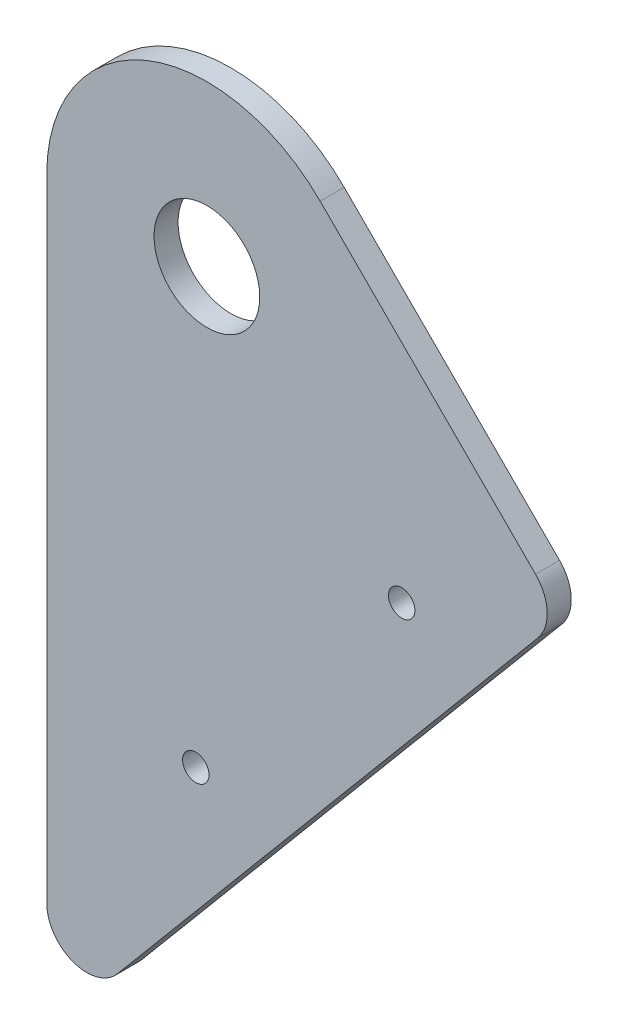
ISO-10303-21;
HEADER;
FILE_DESCRIPTION(('STEP AP214'),'2;1');
FILE_NAME('part.step','',(''),(''),'','','');
FILE_SCHEMA(('AUTOMOTIVE_DESIGN { 1 0 10303 214 1 1 1 1 }'));
ENDSEC;
DATA;
#1=APPLICATION_CONTEXT('core data for automotive mechanical design processes');
#2=APPLICATION_PROTOCOL_DEFINITION('international standard','automotive_design',2000,#1);
#3=PRODUCT_CONTEXT('',#1,'mechanical');
#4=PRODUCT('Part','Part','',(#3));
#5=PRODUCT_RELATED_PRODUCT_CATEGORY('part','',(#4));
#6=PRODUCT_DEFINITION_FORMATION('','',#4);
#7=PRODUCT_DEFINITION_CONTEXT('part definition',#1,'design');
#8=PRODUCT_DEFINITION('design','',#6,#7);
#9=PRODUCT_DEFINITION_SHAPE('','',#8);
#10=(LENGTH_UNIT() NAMED_UNIT(*) SI_UNIT(.MILLI.,.METRE.));
#11=(NAMED_UNIT(*) PLANE_ANGLE_UNIT() SI_UNIT($,.RADIAN.));
#12=(NAMED_UNIT(*) SI_UNIT($,.STERADIAN.) SOLID_ANGLE_UNIT());
#13=UNCERTAINTY_MEASURE_WITH_UNIT(LENGTH_MEASURE(1.E-05),#10,'distance_accuracy_value','');
#14=(GEOMETRIC_REPRESENTATION_CONTEXT(3) GLOBAL_UNCERTAINTY_ASSIGNED_CONTEXT((#13)) GLOBAL_UNIT_ASSIGNED_CONTEXT((#10,
#11,#12)) REPRESENTATION_CONTEXT('',''));
#15=CARTESIAN_POINT('',(0.,0.,0.));
#16=DIRECTION('',(0.,0.,1.));
#17=DIRECTION('',(1.,0.,0.));
#18=AXIS2_PLACEMENT_3D('',#15,#16,#17);
#19=CARTESIAN_POINT('',(0.,0.,3.));
#20=DIRECTION('',(1.,0.,0.));
#21=DIRECTION('',(0.,0.,-1.));
#22=AXIS2_PLACEMENT_3D('',#19,#20,#21);
#23=PLANE('',#22);
#24=DIRECTION('',(0.,-1.,0.));
#25=VECTOR('',#24,1.);
#26=CARTESIAN_POINT('',(0.,0.,0.));
#27=LINE('',#26,#25);
#28=CARTESIAN_POINT('',(0.,92.5989340330901,0.));
#29=VERTEX_POINT('',#28);
#30=CARTESIAN_POINT('',(0.,13.7373870972732,0.));
#31=VERTEX_POINT('',#30);
#32=EDGE_CURVE('E128',#29,#31,#27,.T.);
#33=ORIENTED_EDGE('',*,*,#32,.T.);
#34=DIRECTION('',(0.,0.,-1.));
#35=VECTOR('',#34,1.);
#36=CARTESIAN_POINT('',(0.,13.7373870972732,3.));
#37=LINE('',#36,#35);
#38=CARTESIAN_POINT('',(0.,13.7373870972732,3.));
#39=VERTEX_POINT('',#38);
#40=EDGE_CURVE('E11',#31,#39,#37,.F.);
#41=ORIENTED_EDGE('',*,*,#40,.T.);
#42=DIRECTION('',(0.,-1.,0.));
#43=VECTOR('',#42,1.);
#44=CARTESIAN_POINT('',(0.,0.,3.));
#45=LINE('',#44,#43);
#46=CARTESIAN_POINT('',(0.,92.5989340330901,3.));
#47=VERTEX_POINT('',#46);
#48=EDGE_CURVE('E147',#47,#39,#45,.T.);
#49=ORIENTED_EDGE('',*,*,#48,.F.);
#50=DIRECTION('',(0.,0.,-1.));
#51=VECTOR('',#50,1.);
#52=CARTESIAN_POINT('',(0.,92.5989340330901,3.));
#53=LINE('',#52,#51);
#54=EDGE_CURVE('E111',#47,#29,#53,.T.);
#55=ORIENTED_EDGE('',*,*,#54,.T.);
#56=EDGE_LOOP('',(#33,#41,#49,#55));
#57=FACE_BOUND('',#56,.T.);
#58=ADVANCED_FACE('F37',(#57),#23,.F.);
#59=CARTESIAN_POINT('',(0.,0.,3.));
#60=DIRECTION('',(-0.766044443118982,0.642787609686535,0.));
#61=DIRECTION('',(-0.642787609686535,-0.766044443118982,0.));
#62=AXIS2_PLACEMENT_3D('',#59,#60,#61);
#63=PLANE('',#62);
#64=DIRECTION('',(0.642787609686535,0.766044443118982,0.));
#65=VECTOR('',#64,1.);
#66=CARTESIAN_POINT('',(0.,0.,0.));
#67=LINE('',#66,#65);
#68=CARTESIAN_POINT('',(8.83022221559491,10.5234490488406,0.));
#69=VERTEX_POINT('',#68);
#70=CARTESIAN_POINT('',(61.3337293435139,73.0946922923345,0.));
#71=VERTEX_POINT('',#70);
#72=EDGE_CURVE('E130',#69,#71,#67,.T.);
#73=ORIENTED_EDGE('',*,*,#72,.T.);
#74=DIRECTION('',(0.,0.,-1.));
#75=VECTOR('',#74,1.);
#76=CARTESIAN_POINT('',(61.3337293435139,73.0946922923346,3.));
#77=LINE('',#76,#75);
#78=CARTESIAN_POINT('',(61.3337293435139,73.0946922923345,3.));
#79=VERTEX_POINT('',#78);
#80=EDGE_CURVE('E58',#71,#79,#77,.F.);
#81=ORIENTED_EDGE('',*,*,#80,.T.);
#82=DIRECTION('',(0.642787609686535,0.766044443118982,0.));
#83=VECTOR('',#82,1.);
#84=CARTESIAN_POINT('',(0.,0.,3.));
#85=LINE('',#84,#83);
#86=CARTESIAN_POINT('',(8.83022221559491,10.5234490488406,3.));
#87=VERTEX_POINT('',#86);
#88=EDGE_CURVE('E101',#87,#79,#85,.T.);
#89=ORIENTED_EDGE('',*,*,#88,.F.);
#90=DIRECTION('',(0.,0.,-1.));
#91=VECTOR('',#90,1.);
#92=CARTESIAN_POINT('',(8.83022221559491,10.5234490488406,3.));
#93=LINE('',#92,#91);
#94=EDGE_CURVE('E141',#87,#69,#93,.T.);
#95=ORIENTED_EDGE('',*,*,#94,.T.);
#96=EDGE_LOOP('',(#73,#81,#89,#95));
#97=FACE_BOUND('',#96,.T.);
#98=ADVANCED_FACE('F150',(#97),#63,.F.);
#99=CARTESIAN_POINT('',(70.4416026402761,70.4416026402755,3.));
#100=DIRECTION('',(-0.707106781186551,-0.707106781186544,0.));
#101=DIRECTION('',(0.707106781186544,-0.707106781186551,0.));
#102=AXIS2_PLACEMENT_3D('',#99,#100,#101);
#103=PLANE('',#102);
#104=DIRECTION('',(-0.707106781186544,0.707106781186551,0.));
#105=VECTOR('',#104,1.);
#106=CARTESIAN_POINT('',(70.4416026402761,70.4416026402755,3.));
#107=LINE('',#106,#105);
#108=CARTESIAN_POINT('',(61.0390410338518,79.8441642466999,3.));
#109=VERTEX_POINT('',#108);
#110=CARTESIAN_POINT('',(34.142135623731,106.741069656821,3.));
#111=VERTEX_POINT('',#110);
#112=EDGE_CURVE('E91',#109,#111,#107,.T.);
#113=ORIENTED_EDGE('',*,*,#112,.F.);
#114=DIRECTION('',(0.,0.,-1.));
#115=VECTOR('',#114,1.);
#116=CARTESIAN_POINT('',(61.0390410338518,79.8441642466999,3.));
#117=LINE('',#116,#115);
#118=CARTESIAN_POINT('',(61.0390410338518,79.8441642466999,0.));
#119=VERTEX_POINT('',#118);
#120=EDGE_CURVE('E110',#109,#119,#117,.T.);
#121=ORIENTED_EDGE('',*,*,#120,.T.);
#122=DIRECTION('',(-0.707106781186544,0.707106781186551,0.));
#123=VECTOR('',#122,1.);
#124=CARTESIAN_POINT('',(70.4416026402761,70.4416026402755,0.));
#125=LINE('',#124,#123);
#126=CARTESIAN_POINT('',(34.142135623731,106.741069656821,0.));
#127=VERTEX_POINT('',#126);
#128=EDGE_CURVE('E107',#119,#127,#125,.T.);
#129=ORIENTED_EDGE('',*,*,#128,.T.);
#130=DIRECTION('',(0.,0.,-1.));
#131=VECTOR('',#130,1.);
#132=CARTESIAN_POINT('',(34.142135623731,106.741069656821,3.));
#133=LINE('',#132,#131);
#134=EDGE_CURVE('E104',#111,#127,#133,.T.);
#135=ORIENTED_EDGE('',*,*,#134,.F.);
#136=EDGE_LOOP('',(#113,#121,#129,#135));
#137=FACE_BOUND('',#136,.T.);
#138=ADVANCED_FACE('F105',(#137),#103,.F.);
#139=CARTESIAN_POINT('',(20.,92.5989340330901,3.));
#140=DIRECTION('',(0.,0.,-1.));
#141=DIRECTION('',(-1.,0.,0.));
#142=AXIS2_PLACEMENT_3D('',#139,#140,#141);
#143=CYLINDRICAL_SURFACE('',#142,6.6);
#144=CARTESIAN_POINT('',(20.,92.5989340330901,3.));
#145=DIRECTION('',(0.,0.,1.));
#146=DIRECTION('',(1.,0.,0.));
#147=AXIS2_PLACEMENT_3D('',#144,#145,#146);
#148=CIRCLE('',#147,6.6);
#149=CARTESIAN_POINT('',(26.6,92.5989340330901,3.));
#150=VERTEX_POINT('',#149);
#151=EDGE_CURVE('E155',#150,#150,#148,.T.);
#152=ORIENTED_EDGE('',*,*,#151,.T.);
#153=EDGE_LOOP('',(#152));
#154=FACE_BOUND('',#153,.T.);
#155=CARTESIAN_POINT('',(20.,92.5989340330901,0.));
#156=DIRECTION('',(0.,0.,1.));
#157=DIRECTION('',(1.,0.,0.));
#158=AXIS2_PLACEMENT_3D('',#155,#156,#157);
#159=CIRCLE('',#158,6.6);
#160=CARTESIAN_POINT('',(26.6,92.5989340330901,0.));
#161=VERTEX_POINT('',#160);
#162=EDGE_CURVE('E125',#161,#161,#159,.T.);
#163=ORIENTED_EDGE('',*,*,#162,.F.);
#164=EDGE_LOOP('',(#163));
#165=FACE_BOUND('',#164,.T.);
#166=ADVANCED_FACE('F176',(#154,#165),#143,.F.);
#167=CARTESIAN_POINT('',(44.324930632758,68.3816335916834,3.));
#168=DIRECTION('',(0.,0.,-1.));
#169=DIRECTION('',(-1.,0.,0.));
#170=AXIS2_PLACEMENT_3D('',#167,#168,#169);
#171=CYLINDRICAL_SURFACE('',#170,1.65);
#172=CARTESIAN_POINT('',(44.324930632758,68.3816335916834,3.));
#173=DIRECTION('',(0.,0.,1.));
#174=DIRECTION('',(1.,0.,0.));
#175=AXIS2_PLACEMENT_3D('',#172,#173,#174);
#176=CIRCLE('',#175,1.65);
#177=CARTESIAN_POINT('',(45.974930632758,68.3816335916834,3.));
#178=VERTEX_POINT('',#177);
#179=EDGE_CURVE('E158',#178,#178,#176,.T.);
#180=ORIENTED_EDGE('',*,*,#179,.T.);
#181=EDGE_LOOP('',(#180));
#182=FACE_BOUND('',#181,.T.);
#183=CARTESIAN_POINT('',(44.324930632758,68.3816335916834,0.));
#184=DIRECTION('',(0.,0.,1.));
#185=DIRECTION('',(1.,0.,0.));
#186=AXIS2_PLACEMENT_3D('',#183,#184,#185);
#187=CIRCLE('',#186,1.65);
#188=CARTESIAN_POINT('',(45.974930632758,68.3816335916834,0.));
#189=VERTEX_POINT('',#188);
#190=EDGE_CURVE('E122',#189,#189,#187,.T.);
#191=ORIENTED_EDGE('',*,*,#190,.F.);
#192=EDGE_LOOP('',(#191));
#193=FACE_BOUND('',#192,.T.);
#194=ADVANCED_FACE('F179',(#182,#193),#171,.F.);
#195=CARTESIAN_POINT('',(18.6134262452966,37.7398558669241,3.));
#196=DIRECTION('',(0.,0.,-1.));
#197=DIRECTION('',(-1.,0.,0.));
#198=AXIS2_PLACEMENT_3D('',#195,#196,#197);
#199=CYLINDRICAL_SURFACE('',#198,1.64999999999998);
#200=CARTESIAN_POINT('',(18.6134262452966,37.7398558669241,3.));
#201=DIRECTION('',(0.,0.,1.));
#202=DIRECTION('',(1.,0.,0.));
#203=AXIS2_PLACEMENT_3D('',#200,#201,#202);
#204=CIRCLE('',#203,1.64999999999998);
#205=CARTESIAN_POINT('',(20.2634262452966,37.7398558669241,3.));
#206=VERTEX_POINT('',#205);
#207=EDGE_CURVE('E134',#206,#206,#204,.T.);
#208=ORIENTED_EDGE('',*,*,#207,.T.);
#209=EDGE_LOOP('',(#208));
#210=FACE_BOUND('',#209,.T.);
#211=CARTESIAN_POINT('',(18.6134262452966,37.7398558669241,0.));
#212=DIRECTION('',(0.,0.,1.));
#213=DIRECTION('',(1.,0.,0.));
#214=AXIS2_PLACEMENT_3D('',#211,#212,#213);
#215=CIRCLE('',#214,1.64999999999998);
#216=CARTESIAN_POINT('',(20.2634262452966,37.7398558669241,0.));
#217=VERTEX_POINT('',#216);
#218=EDGE_CURVE('E119',#217,#217,#215,.T.);
#219=ORIENTED_EDGE('',*,*,#218,.F.);
#220=EDGE_LOOP('',(#219));
#221=FACE_BOUND('',#220,.T.);
#222=ADVANCED_FACE('F166',(#210,#221),#199,.F.);
#223=CARTESIAN_POINT('',(20.,92.5989340330901,3.));
#224=DIRECTION('',(0.,0.,-1.));
#225=DIRECTION('',(-1.,0.,0.));
#226=AXIS2_PLACEMENT_3D('',#223,#224,#225);
#227=CYLINDRICAL_SURFACE('',#226,20.);
#228=CARTESIAN_POINT('',(20.,92.5989340330901,0.));
#229=DIRECTION('',(0.,0.,1.));
#230=DIRECTION('',(1.,0.,0.));
#231=AXIS2_PLACEMENT_3D('',#228,#229,#230);
#232=CIRCLE('',#231,20.);
#233=EDGE_CURVE('E133',#127,#29,#232,.T.);
#234=ORIENTED_EDGE('',*,*,#233,.T.);
#235=ORIENTED_EDGE('',*,*,#54,.F.);
#236=CARTESIAN_POINT('',(20.,92.5989340330901,3.));
#237=DIRECTION('',(0.,0.,1.));
#238=DIRECTION('',(1.,0.,0.));
#239=AXIS2_PLACEMENT_3D('',#236,#237,#238);
#240=CIRCLE('',#239,20.);
#241=EDGE_CURVE('E95',#111,#47,#240,.T.);
#242=ORIENTED_EDGE('',*,*,#241,.F.);
#243=ORIENTED_EDGE('',*,*,#134,.T.);
#244=EDGE_LOOP('',(#234,#235,#242,#243));
#245=FACE_BOUND('',#244,.T.);
#246=ADVANCED_FACE('F113',(#245),#227,.T.);
#247=CARTESIAN_POINT('',(0.,0.,3.));
#248=DIRECTION('',(0.,0.,1.));
#249=DIRECTION('',(1.,0.,0.));
#250=AXIS2_PLACEMENT_3D('',#247,#248,#249);
#251=PLANE('',#250);
#252=ORIENTED_EDGE('',*,*,#207,.F.);
#253=EDGE_LOOP('',(#252));
#254=FACE_BOUND('',#253,.T.);
#255=ORIENTED_EDGE('',*,*,#179,.F.);
#256=EDGE_LOOP('',(#255));
#257=FACE_BOUND('',#256,.T.);
#258=ORIENTED_EDGE('',*,*,#151,.F.);
#259=EDGE_LOOP('',(#258));
#260=FACE_BOUND('',#259,.T.);
#261=ORIENTED_EDGE('',*,*,#88,.T.);
#262=CARTESIAN_POINT('',(57.503507127919,76.3086303407672,3.));
#263=DIRECTION('',(0.,0.,1.));
#264=DIRECTION('',(1.,0.,0.));
#265=AXIS2_PLACEMENT_3D('',#262,#263,#264);
#266=CIRCLE('',#265,5.);
#267=EDGE_CURVE('E45',#79,#109,#266,.T.);
#268=ORIENTED_EDGE('',*,*,#267,.T.);
#269=ORIENTED_EDGE('',*,*,#112,.T.);
#270=ORIENTED_EDGE('',*,*,#241,.T.);
#271=ORIENTED_EDGE('',*,*,#48,.T.);
#272=CARTESIAN_POINT('',(5.,13.7373870972732,3.));
#273=DIRECTION('',(0.,0.,1.));
#274=DIRECTION('',(1.,0.,0.));
#275=AXIS2_PLACEMENT_3D('',#272,#273,#274);
#276=CIRCLE('',#275,5.);
#277=EDGE_CURVE('E145',#39,#87,#276,.T.);
#278=ORIENTED_EDGE('',*,*,#277,.T.);
#279=EDGE_LOOP('',(#261,#268,#269,#270,#271,#278));
#280=FACE_BOUND('',#279,.T.);
#281=ADVANCED_FACE('F93',(#254,#257,#260,#280),#251,.T.);
#282=CARTESIAN_POINT('',(0.,0.,0.));
#283=DIRECTION('',(0.,0.,1.));
#284=DIRECTION('',(1.,0.,0.));
#285=AXIS2_PLACEMENT_3D('',#282,#283,#284);
#286=PLANE('',#285);
#287=ORIENTED_EDGE('',*,*,#218,.T.);
#288=EDGE_LOOP('',(#287));
#289=FACE_BOUND('',#288,.T.);
#290=ORIENTED_EDGE('',*,*,#190,.T.);
#291=EDGE_LOOP('',(#290));
#292=FACE_BOUND('',#291,.T.);
#293=ORIENTED_EDGE('',*,*,#162,.T.);
#294=EDGE_LOOP('',(#293));
#295=FACE_BOUND('',#294,.T.);
#296=ORIENTED_EDGE('',*,*,#128,.F.);
#297=CARTESIAN_POINT('',(57.503507127919,76.3086303407672,0.));
#298=DIRECTION('',(0.,0.,1.));
#299=DIRECTION('',(1.,0.,0.));
#300=AXIS2_PLACEMENT_3D('',#297,#298,#299);
#301=CIRCLE('',#300,5.);
#302=EDGE_CURVE('E139',#119,#71,#301,.F.);
#303=ORIENTED_EDGE('',*,*,#302,.T.);
#304=ORIENTED_EDGE('',*,*,#72,.F.);
#305=CARTESIAN_POINT('',(5.,13.7373870972732,0.));
#306=DIRECTION('',(0.,0.,1.));
#307=DIRECTION('',(1.,0.,0.));
#308=AXIS2_PLACEMENT_3D('',#305,#306,#307);
#309=CIRCLE('',#308,5.);
#310=EDGE_CURVE('E137',#69,#31,#309,.F.);
#311=ORIENTED_EDGE('',*,*,#310,.T.);
#312=ORIENTED_EDGE('',*,*,#32,.F.);
#313=ORIENTED_EDGE('',*,*,#233,.F.);
#314=EDGE_LOOP('',(#296,#303,#304,#311,#312,#313));
#315=FACE_BOUND('',#314,.T.);
#316=ADVANCED_FACE('F154',(#289,#292,#295,#315),#286,.F.);
#317=CARTESIAN_POINT('',(57.503507127919,76.3086303407672,3.));
#318=DIRECTION('',(0.,0.,-1.));
#319=DIRECTION('',(-1.,0.,0.));
#320=AXIS2_PLACEMENT_3D('',#317,#318,#319);
#321=CYLINDRICAL_SURFACE('',#320,5.);
#322=ORIENTED_EDGE('',*,*,#267,.F.);
#323=ORIENTED_EDGE('',*,*,#80,.F.);
#324=ORIENTED_EDGE('',*,*,#302,.F.);
#325=ORIENTED_EDGE('',*,*,#120,.F.);
#326=EDGE_LOOP('',(#322,#323,#324,#325));
#327=FACE_BOUND('',#326,.T.);
#328=ADVANCED_FACE('F184',(#327),#321,.T.);
#329=CARTESIAN_POINT('',(5.,13.7373870972732,3.));
#330=DIRECTION('',(0.,0.,-1.));
#331=DIRECTION('',(-1.,0.,0.));
#332=AXIS2_PLACEMENT_3D('',#329,#330,#331);
#333=CYLINDRICAL_SURFACE('',#332,5.);
#334=ORIENTED_EDGE('',*,*,#277,.F.);
#335=ORIENTED_EDGE('',*,*,#40,.F.);
#336=ORIENTED_EDGE('',*,*,#310,.F.);
#337=ORIENTED_EDGE('',*,*,#94,.F.);
#338=EDGE_LOOP('',(#334,#335,#336,#337));
#339=FACE_BOUND('',#338,.T.);
#340=ADVANCED_FACE('F39',(#339),#333,.T.);
#341=CLOSED_SHELL('',(#58,#98,#138,#166,#194,#222,#246,#281,#316,#328,#340));
#342=MANIFOLD_SOLID_BREP('B2',#341);
#343=ADVANCED_BREP_SHAPE_REPRESENTATION('',(#18,#342),#14);
#344=SHAPE_DEFINITION_REPRESENTATION(#9,#343);
ENDSEC;
END-ISO-10303-21;
